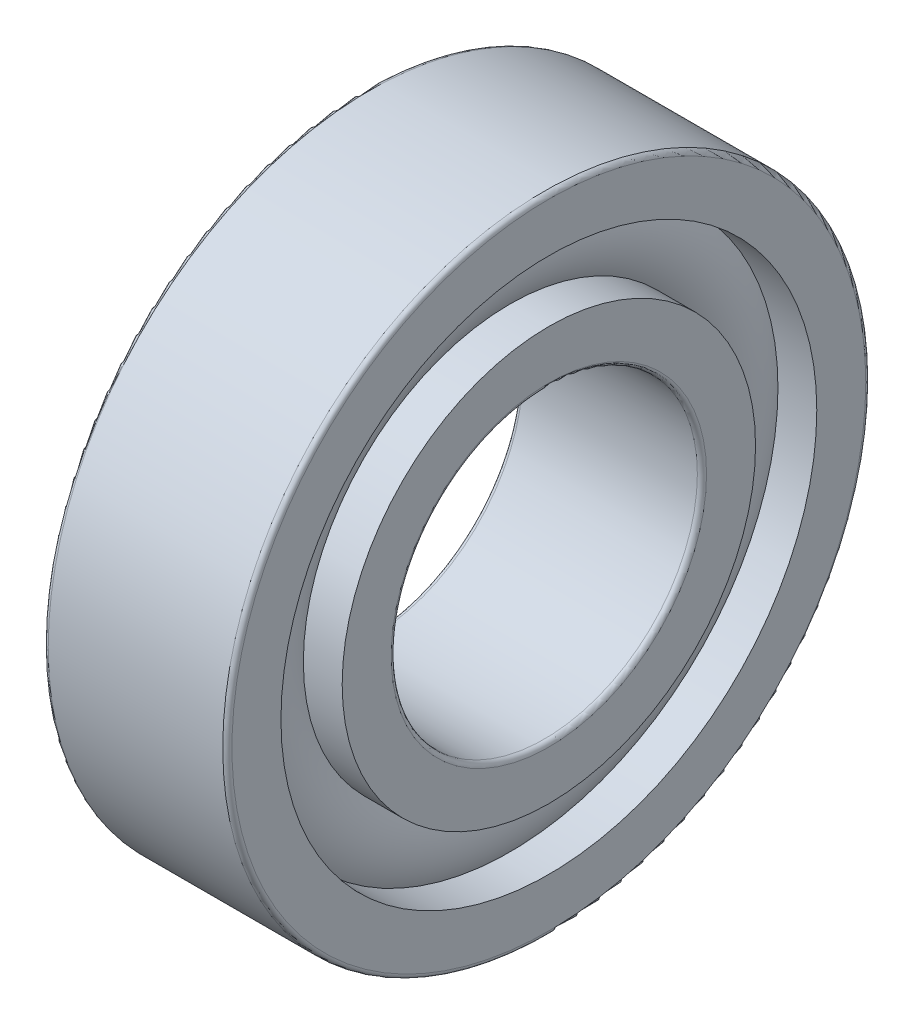
ISO-10303-21;
HEADER;
FILE_DESCRIPTION(('STEP AP214'),'2;1');
FILE_NAME('part.step','',(''),(''),'','','');
FILE_SCHEMA(('AUTOMOTIVE_DESIGN { 1 0 10303 214 1 1 1 1 }'));
ENDSEC;
DATA;
#1=APPLICATION_CONTEXT('core data for automotive mechanical design processes');
#2=APPLICATION_PROTOCOL_DEFINITION('international standard','automotive_design',2000,#1);
#3=PRODUCT_CONTEXT('',#1,'mechanical');
#4=PRODUCT('Part','Part','',(#3));
#5=PRODUCT_RELATED_PRODUCT_CATEGORY('part','',(#4));
#6=PRODUCT_DEFINITION_FORMATION('','',#4);
#7=PRODUCT_DEFINITION_CONTEXT('part definition',#1,'design');
#8=PRODUCT_DEFINITION('design','',#6,#7);
#9=PRODUCT_DEFINITION_SHAPE('','',#8);
#10=(LENGTH_UNIT() NAMED_UNIT(*) SI_UNIT(.MILLI.,.METRE.));
#11=(NAMED_UNIT(*) PLANE_ANGLE_UNIT() SI_UNIT($,.RADIAN.));
#12=(NAMED_UNIT(*) SI_UNIT($,.STERADIAN.) SOLID_ANGLE_UNIT());
#13=UNCERTAINTY_MEASURE_WITH_UNIT(LENGTH_MEASURE(1.E-05),#10,'distance_accuracy_value','');
#14=(GEOMETRIC_REPRESENTATION_CONTEXT(3) GLOBAL_UNCERTAINTY_ASSIGNED_CONTEXT((#13)) GLOBAL_UNIT_ASSIGNED_CONTEXT((#10,
#11,#12)) REPRESENTATION_CONTEXT('',''));
#15=CARTESIAN_POINT('',(0.,0.,0.));
#16=DIRECTION('',(0.,0.,1.));
#17=DIRECTION('',(1.,0.,0.));
#18=AXIS2_PLACEMENT_3D('',#15,#16,#17);
#19=CARTESIAN_POINT('',(6.,21.,0.));
#20=DIRECTION('',(1.,0.,0.));
#21=DIRECTION('',(0.,0.,-1.));
#22=AXIS2_PLACEMENT_3D('',#19,#20,#21);
#23=PLANE('',#22);
#24=CARTESIAN_POINT('',(6.,0.,0.));
#25=DIRECTION('',(1.,0.,0.));
#26=DIRECTION('',(0.,0.,-1.));
#27=AXIS2_PLACEMENT_3D('',#24,#25,#26);
#28=CIRCLE('',#27,20.7);
#29=CARTESIAN_POINT('',(6.,0.,-20.7));
#30=VERTEX_POINT('',#29);
#31=EDGE_CURVE('E47',#30,#30,#28,.T.);
#32=ORIENTED_EDGE('',*,*,#31,.T.);
#33=EDGE_LOOP('',(#32));
#34=FACE_BOUND('',#33,.T.);
#35=CARTESIAN_POINT('',(6.,0.,0.));
#36=DIRECTION('',(1.,0.,0.));
#37=DIRECTION('',(0.,0.,-1.));
#38=AXIS2_PLACEMENT_3D('',#35,#36,#37);
#39=CIRCLE('',#38,17.5);
#40=CARTESIAN_POINT('',(6.,0.,-17.5));
#41=VERTEX_POINT('',#40);
#42=EDGE_CURVE('E85',#41,#41,#39,.T.);
#43=ORIENTED_EDGE('',*,*,#42,.F.);
#44=EDGE_LOOP('',(#43));
#45=FACE_BOUND('',#44,.T.);
#46=ADVANCED_FACE('F32',(#34,#45),#23,.T.);
#47=CARTESIAN_POINT('',(60.8290828007624,0.,0.));
#48=DIRECTION('',(1.,0.,0.));
#49=DIRECTION('',(0.,0.,-1.));
#50=AXIS2_PLACEMENT_3D('',#47,#48,#49);
#51=CYLINDRICAL_SURFACE('',#50,21.);
#52=CARTESIAN_POINT('',(5.7,0.,0.));
#53=DIRECTION('',(1.,0.,0.));
#54=DIRECTION('',(0.,0.,-1.));
#55=AXIS2_PLACEMENT_3D('',#52,#53,#54);
#56=CIRCLE('',#55,21.);
#57=CARTESIAN_POINT('',(5.7,0.,-21.));
#58=VERTEX_POINT('',#57);
#59=EDGE_CURVE('E39',#58,#58,#56,.F.);
#60=ORIENTED_EDGE('',*,*,#59,.T.);
#61=EDGE_LOOP('',(#60));
#62=FACE_BOUND('',#61,.T.);
#63=CARTESIAN_POINT('',(-5.7,0.,0.));
#64=DIRECTION('',(-1.,0.,0.));
#65=DIRECTION('',(0.,0.,1.));
#66=AXIS2_PLACEMENT_3D('',#63,#64,#65);
#67=CIRCLE('',#66,21.);
#68=CARTESIAN_POINT('',(-5.7,0.,21.));
#69=VERTEX_POINT('',#68);
#70=EDGE_CURVE('E43',#69,#69,#67,.F.);
#71=ORIENTED_EDGE('',*,*,#70,.T.);
#72=EDGE_LOOP('',(#71));
#73=FACE_BOUND('',#72,.T.);
#74=ADVANCED_FACE('F93',(#62,#73),#51,.T.);
#75=CARTESIAN_POINT('',(-6.,21.,0.));
#76=DIRECTION('',(-1.,0.,0.));
#77=DIRECTION('',(0.,0.,1.));
#78=AXIS2_PLACEMENT_3D('',#75,#76,#77);
#79=PLANE('',#78);
#80=CARTESIAN_POINT('',(-6.,0.,0.));
#81=DIRECTION('',(-1.,0.,0.));
#82=DIRECTION('',(0.,0.,1.));
#83=AXIS2_PLACEMENT_3D('',#80,#81,#82);
#84=CIRCLE('',#83,20.7);
#85=CARTESIAN_POINT('',(-6.,0.,20.7));
#86=VERTEX_POINT('',#85);
#87=EDGE_CURVE('E10',#86,#86,#84,.T.);
#88=ORIENTED_EDGE('',*,*,#87,.T.);
#89=EDGE_LOOP('',(#88));
#90=FACE_BOUND('',#89,.T.);
#91=CARTESIAN_POINT('',(-6.00000000000001,0.,0.));
#92=DIRECTION('',(1.,0.,0.));
#93=DIRECTION('',(0.,0.,-1.));
#94=AXIS2_PLACEMENT_3D('',#91,#92,#93);
#95=CIRCLE('',#94,17.5);
#96=CARTESIAN_POINT('',(-6.00000000000001,0.,-17.5));
#97=VERTEX_POINT('',#96);
#98=EDGE_CURVE('E64',#97,#97,#95,.T.);
#99=ORIENTED_EDGE('',*,*,#98,.T.);
#100=EDGE_LOOP('',(#99));
#101=FACE_BOUND('',#100,.T.);
#102=ADVANCED_FACE('F99',(#90,#101),#79,.T.);
#103=CARTESIAN_POINT('',(60.8290828007624,0.,0.));
#104=DIRECTION('',(1.,0.,0.));
#105=DIRECTION('',(0.,0.,-1.));
#106=AXIS2_PLACEMENT_3D('',#103,#104,#105);
#107=CYLINDRICAL_SURFACE('',#106,17.5);
#108=CARTESIAN_POINT('',(-3.46410161513776,0.,0.));
#109=DIRECTION('',(1.,0.,0.));
#110=DIRECTION('',(0.,0.,-1.));
#111=AXIS2_PLACEMENT_3D('',#108,#109,#110);
#112=CIRCLE('',#111,17.5);
#113=CARTESIAN_POINT('',(-3.46410161513776,0.,-17.5));
#114=VERTEX_POINT('',#113);
#115=EDGE_CURVE('E67',#114,#114,#112,.T.);
#116=ORIENTED_EDGE('',*,*,#115,.T.);
#117=EDGE_LOOP('',(#116));
#118=FACE_BOUND('',#117,.T.);
#119=ORIENTED_EDGE('',*,*,#98,.F.);
#120=EDGE_LOOP('',(#119));
#121=FACE_BOUND('',#120,.T.);
#122=ADVANCED_FACE('F187',(#118,#121),#107,.F.);
#123=CARTESIAN_POINT('',(0.,0.,0.));
#124=DIRECTION('',(1.,0.,0.));
#125=DIRECTION('',(0.,0.,-1.));
#126=AXIS2_PLACEMENT_3D('',#123,#124,#125);
#127=TOROIDAL_SURFACE('',#126,15.5,4.);
#128=CARTESIAN_POINT('',(-3.46410161513776,0.,0.));
#129=DIRECTION('',(1.,0.,0.));
#130=DIRECTION('',(0.,0.,-1.));
#131=AXIS2_PLACEMENT_3D('',#128,#129,#130);
#132=CIRCLE('',#131,13.5);
#133=CARTESIAN_POINT('',(-3.46410161513776,0.,-13.5));
#134=VERTEX_POINT('',#133);
#135=EDGE_CURVE('E70',#134,#134,#132,.T.);
#136=ORIENTED_EDGE('',*,*,#135,.T.);
#137=EDGE_LOOP('',(#136));
#138=FACE_BOUND('',#137,.T.);
#139=ORIENTED_EDGE('',*,*,#115,.F.);
#140=EDGE_LOOP('',(#139));
#141=FACE_BOUND('',#140,.T.);
#142=ADVANCED_FACE('F228',(#138,#141),#127,.T.);
#143=CARTESIAN_POINT('',(60.8290828007624,0.,0.));
#144=DIRECTION('',(1.,0.,0.));
#145=DIRECTION('',(0.,0.,-1.));
#146=AXIS2_PLACEMENT_3D('',#143,#144,#145);
#147=CYLINDRICAL_SURFACE('',#146,13.5);
#148=CARTESIAN_POINT('',(-6.00000000000001,0.,0.));
#149=DIRECTION('',(1.,0.,0.));
#150=DIRECTION('',(0.,0.,-1.));
#151=AXIS2_PLACEMENT_3D('',#148,#149,#150);
#152=CIRCLE('',#151,13.5);
#153=CARTESIAN_POINT('',(-6.00000000000001,0.,-13.5));
#154=VERTEX_POINT('',#153);
#155=EDGE_CURVE('E73',#154,#154,#152,.T.);
#156=ORIENTED_EDGE('',*,*,#155,.T.);
#157=EDGE_LOOP('',(#156));
#158=FACE_BOUND('',#157,.T.);
#159=ORIENTED_EDGE('',*,*,#135,.F.);
#160=EDGE_LOOP('',(#159));
#161=FACE_BOUND('',#160,.T.);
#162=ADVANCED_FACE('F175',(#158,#161),#147,.T.);
#163=CARTESIAN_POINT('',(-6.,13.5,0.));
#164=DIRECTION('',(-1.,0.,0.));
#165=DIRECTION('',(0.,0.,1.));
#166=AXIS2_PLACEMENT_3D('',#163,#164,#165);
#167=PLANE('',#166);
#168=CARTESIAN_POINT('',(-6.,0.,0.));
#169=DIRECTION('',(-1.,0.,0.));
#170=DIRECTION('',(0.,0.,1.));
#171=AXIS2_PLACEMENT_3D('',#168,#169,#170);
#172=CIRCLE('',#171,10.3);
#173=CARTESIAN_POINT('',(-6.,0.,10.3));
#174=VERTEX_POINT('',#173);
#175=EDGE_CURVE('E61',#174,#174,#172,.F.);
#176=ORIENTED_EDGE('',*,*,#175,.T.);
#177=EDGE_LOOP('',(#176));
#178=FACE_BOUND('',#177,.T.);
#179=ORIENTED_EDGE('',*,*,#155,.F.);
#180=EDGE_LOOP('',(#179));
#181=FACE_BOUND('',#180,.T.);
#182=ADVANCED_FACE('F165',(#178,#181),#167,.T.);
#183=CARTESIAN_POINT('',(60.8290828007624,0.,0.));
#184=DIRECTION('',(1.,0.,0.));
#185=DIRECTION('',(0.,0.,-1.));
#186=AXIS2_PLACEMENT_3D('',#183,#184,#185);
#187=CYLINDRICAL_SURFACE('',#186,9.99999999999999);
#188=CARTESIAN_POINT('',(-5.7,0.,0.));
#189=DIRECTION('',(-1.,0.,0.));
#190=DIRECTION('',(0.,0.,1.));
#191=AXIS2_PLACEMENT_3D('',#188,#189,#190);
#192=CIRCLE('',#191,9.99999999999999);
#193=CARTESIAN_POINT('',(-5.7,0.,9.99999999999999));
#194=VERTEX_POINT('',#193);
#195=EDGE_CURVE('E55',#194,#194,#192,.T.);
#196=ORIENTED_EDGE('',*,*,#195,.T.);
#197=EDGE_LOOP('',(#196));
#198=FACE_BOUND('',#197,.T.);
#199=CARTESIAN_POINT('',(5.7,0.,0.));
#200=DIRECTION('',(1.,0.,0.));
#201=DIRECTION('',(0.,0.,-1.));
#202=AXIS2_PLACEMENT_3D('',#199,#200,#201);
#203=CIRCLE('',#202,9.99999999999999);
#204=CARTESIAN_POINT('',(5.7,0.,-9.99999999999999));
#205=VERTEX_POINT('',#204);
#206=EDGE_CURVE('E58',#205,#205,#203,.T.);
#207=ORIENTED_EDGE('',*,*,#206,.T.);
#208=EDGE_LOOP('',(#207));
#209=FACE_BOUND('',#208,.T.);
#210=ADVANCED_FACE('F153',(#198,#209),#187,.F.);
#211=CARTESIAN_POINT('',(6.,13.5,0.));
#212=DIRECTION('',(1.,0.,0.));
#213=DIRECTION('',(0.,0.,-1.));
#214=AXIS2_PLACEMENT_3D('',#211,#212,#213);
#215=PLANE('',#214);
#216=CARTESIAN_POINT('',(6.,0.,0.));
#217=DIRECTION('',(1.,0.,0.));
#218=DIRECTION('',(0.,0.,-1.));
#219=AXIS2_PLACEMENT_3D('',#216,#217,#218);
#220=CIRCLE('',#219,10.3);
#221=CARTESIAN_POINT('',(6.,0.,-10.3));
#222=VERTEX_POINT('',#221);
#223=EDGE_CURVE('E52',#222,#222,#220,.F.);
#224=ORIENTED_EDGE('',*,*,#223,.T.);
#225=EDGE_LOOP('',(#224));
#226=FACE_BOUND('',#225,.T.);
#227=CARTESIAN_POINT('',(6.00000000000001,0.,0.));
#228=DIRECTION('',(1.,0.,0.));
#229=DIRECTION('',(0.,0.,-1.));
#230=AXIS2_PLACEMENT_3D('',#227,#228,#229);
#231=CIRCLE('',#230,13.5);
#232=CARTESIAN_POINT('',(6.00000000000001,0.,-13.5));
#233=VERTEX_POINT('',#232);
#234=EDGE_CURVE('E76',#233,#233,#231,.T.);
#235=ORIENTED_EDGE('',*,*,#234,.T.);
#236=EDGE_LOOP('',(#235));
#237=FACE_BOUND('',#236,.T.);
#238=ADVANCED_FACE('F147',(#226,#237),#215,.T.);
#239=CARTESIAN_POINT('',(60.8290828007624,0.,0.));
#240=DIRECTION('',(1.,0.,0.));
#241=DIRECTION('',(0.,0.,-1.));
#242=AXIS2_PLACEMENT_3D('',#239,#240,#241);
#243=CYLINDRICAL_SURFACE('',#242,13.5);
#244=CARTESIAN_POINT('',(3.46410161513776,0.,0.));
#245=DIRECTION('',(1.,0.,0.));
#246=DIRECTION('',(0.,0.,-1.));
#247=AXIS2_PLACEMENT_3D('',#244,#245,#246);
#248=CIRCLE('',#247,13.5);
#249=CARTESIAN_POINT('',(3.46410161513776,0.,-13.5));
#250=VERTEX_POINT('',#249);
#251=EDGE_CURVE('E79',#250,#250,#248,.T.);
#252=ORIENTED_EDGE('',*,*,#251,.T.);
#253=EDGE_LOOP('',(#252));
#254=FACE_BOUND('',#253,.T.);
#255=ORIENTED_EDGE('',*,*,#234,.F.);
#256=EDGE_LOOP('',(#255));
#257=FACE_BOUND('',#256,.T.);
#258=ADVANCED_FACE('F152',(#254,#257),#243,.T.);
#259=CARTESIAN_POINT('',(0.,0.,0.));
#260=DIRECTION('',(1.,0.,0.));
#261=DIRECTION('',(0.,0.,-1.));
#262=AXIS2_PLACEMENT_3D('',#259,#260,#261);
#263=TOROIDAL_SURFACE('',#262,15.5,4.);
#264=CARTESIAN_POINT('',(3.46410161513776,0.,0.));
#265=DIRECTION('',(1.,0.,0.));
#266=DIRECTION('',(0.,0.,-1.));
#267=AXIS2_PLACEMENT_3D('',#264,#265,#266);
#268=CIRCLE('',#267,17.5);
#269=CARTESIAN_POINT('',(3.46410161513776,0.,-17.5));
#270=VERTEX_POINT('',#269);
#271=EDGE_CURVE('E82',#270,#270,#268,.T.);
#272=ORIENTED_EDGE('',*,*,#271,.T.);
#273=EDGE_LOOP('',(#272));
#274=FACE_BOUND('',#273,.T.);
#275=ORIENTED_EDGE('',*,*,#251,.F.);
#276=EDGE_LOOP('',(#275));
#277=FACE_BOUND('',#276,.T.);
#278=ADVANCED_FACE('F205',(#274,#277),#263,.T.);
#279=CARTESIAN_POINT('',(60.8290828007624,0.,0.));
#280=DIRECTION('',(1.,0.,0.));
#281=DIRECTION('',(0.,0.,-1.));
#282=AXIS2_PLACEMENT_3D('',#279,#280,#281);
#283=CYLINDRICAL_SURFACE('',#282,17.5);
#284=ORIENTED_EDGE('',*,*,#42,.T.);
#285=EDGE_LOOP('',(#284));
#286=FACE_BOUND('',#285,.T.);
#287=ORIENTED_EDGE('',*,*,#271,.F.);
#288=EDGE_LOOP('',(#287));
#289=FACE_BOUND('',#288,.T.);
#290=ADVANCED_FACE('F89',(#286,#289),#283,.F.);
#291=CARTESIAN_POINT('',(-5.7,0.,0.));
#292=DIRECTION('',(-1.,0.,0.));
#293=DIRECTION('',(0.,0.,1.));
#294=AXIS2_PLACEMENT_3D('',#291,#292,#293);
#295=TOROIDAL_SURFACE('',#294,10.3,0.3);
#296=ORIENTED_EDGE('',*,*,#195,.F.);
#297=EDGE_LOOP('',(#296));
#298=FACE_BOUND('',#297,.T.);
#299=ORIENTED_EDGE('',*,*,#175,.F.);
#300=EDGE_LOOP('',(#299));
#301=FACE_BOUND('',#300,.T.);
#302=ADVANCED_FACE('F103',(#298,#301),#295,.T.);
#303=CARTESIAN_POINT('',(5.7,0.,0.));
#304=DIRECTION('',(1.,0.,0.));
#305=DIRECTION('',(0.,0.,-1.));
#306=AXIS2_PLACEMENT_3D('',#303,#304,#305);
#307=TOROIDAL_SURFACE('',#306,10.3,0.3);
#308=ORIENTED_EDGE('',*,*,#223,.F.);
#309=EDGE_LOOP('',(#308));
#310=FACE_BOUND('',#309,.T.);
#311=ORIENTED_EDGE('',*,*,#206,.F.);
#312=EDGE_LOOP('',(#311));
#313=FACE_BOUND('',#312,.T.);
#314=ADVANCED_FACE('F106',(#310,#313),#307,.T.);
#315=CARTESIAN_POINT('',(5.7,0.,0.));
#316=DIRECTION('',(1.,0.,0.));
#317=DIRECTION('',(0.,0.,-1.));
#318=AXIS2_PLACEMENT_3D('',#315,#316,#317);
#319=TOROIDAL_SURFACE('',#318,20.7,0.3);
#320=ORIENTED_EDGE('',*,*,#59,.F.);
#321=EDGE_LOOP('',(#320));
#322=FACE_BOUND('',#321,.T.);
#323=ORIENTED_EDGE('',*,*,#31,.F.);
#324=EDGE_LOOP('',(#323));
#325=FACE_BOUND('',#324,.T.);
#326=ADVANCED_FACE('F109',(#322,#325),#319,.T.);
#327=CARTESIAN_POINT('',(-5.7,0.,0.));
#328=DIRECTION('',(-1.,0.,0.));
#329=DIRECTION('',(0.,0.,1.));
#330=AXIS2_PLACEMENT_3D('',#327,#328,#329);
#331=TOROIDAL_SURFACE('',#330,20.7,0.3);
#332=ORIENTED_EDGE('',*,*,#87,.F.);
#333=EDGE_LOOP('',(#332));
#334=FACE_BOUND('',#333,.T.);
#335=ORIENTED_EDGE('',*,*,#70,.F.);
#336=EDGE_LOOP('',(#335));
#337=FACE_BOUND('',#336,.T.);
#338=ADVANCED_FACE('F34',(#334,#337),#331,.T.);
#339=CLOSED_SHELL('',(#46,#74,#102,#122,#142,#162,#182,#210,#238,#258,#278,#290,#302,#314,#326,#338));
#340=MANIFOLD_SOLID_BREP('B2',#339);
#341=ADVANCED_BREP_SHAPE_REPRESENTATION('',(#18,#340),#14);
#342=SHAPE_DEFINITION_REPRESENTATION(#9,#341);
ENDSEC;
END-ISO-10303-21;
